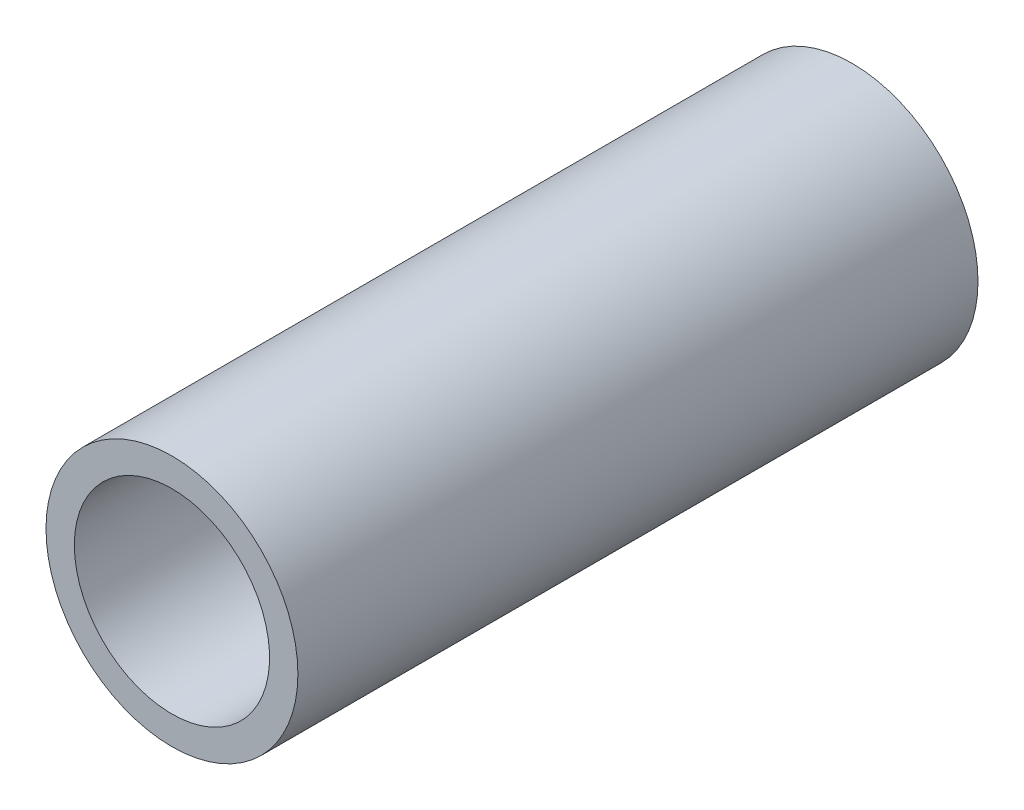
ISO-10303-21;
HEADER;
FILE_DESCRIPTION(('STEP AP214'),'2;1');
FILE_NAME('part.step','',(''),(''),'','','');
FILE_SCHEMA(('AUTOMOTIVE_DESIGN { 1 0 10303 214 1 1 1 1 }'));
ENDSEC;
DATA;
#1=APPLICATION_CONTEXT('core data for automotive mechanical design processes');
#2=APPLICATION_PROTOCOL_DEFINITION('international standard','automotive_design',2000,#1);
#3=PRODUCT_CONTEXT('',#1,'mechanical');
#4=PRODUCT('Part','Part','',(#3));
#5=PRODUCT_RELATED_PRODUCT_CATEGORY('part','',(#4));
#6=PRODUCT_DEFINITION_FORMATION('','',#4);
#7=PRODUCT_DEFINITION_CONTEXT('part definition',#1,'design');
#8=PRODUCT_DEFINITION('design','',#6,#7);
#9=PRODUCT_DEFINITION_SHAPE('','',#8);
#10=(LENGTH_UNIT() NAMED_UNIT(*) SI_UNIT(.MILLI.,.METRE.));
#11=(NAMED_UNIT(*) PLANE_ANGLE_UNIT() SI_UNIT($,.RADIAN.));
#12=(NAMED_UNIT(*) SI_UNIT($,.STERADIAN.) SOLID_ANGLE_UNIT());
#13=UNCERTAINTY_MEASURE_WITH_UNIT(LENGTH_MEASURE(1.E-05),#10,'distance_accuracy_value','');
#14=(GEOMETRIC_REPRESENTATION_CONTEXT(3) GLOBAL_UNCERTAINTY_ASSIGNED_CONTEXT((#13)) GLOBAL_UNIT_ASSIGNED_CONTEXT((#10,
#11,#12)) REPRESENTATION_CONTEXT('',''));
#15=CARTESIAN_POINT('',(0.,0.,0.));
#16=DIRECTION('',(0.,0.,1.));
#17=DIRECTION('',(1.,0.,0.));
#18=AXIS2_PLACEMENT_3D('',#15,#16,#17);
#19=CARTESIAN_POINT('',(0.,0.,5.4));
#20=DIRECTION('',(0.,0.,1.));
#21=DIRECTION('',(1.,0.,0.));
#22=AXIS2_PLACEMENT_3D('',#19,#20,#21);
#23=PLANE('',#22);
#24=CARTESIAN_POINT('',(0.,0.,5.4));
#25=DIRECTION('',(0.,0.,1.));
#26=DIRECTION('',(1.,0.,0.));
#27=AXIS2_PLACEMENT_3D('',#24,#25,#26);
#28=CIRCLE('',#27,1.);
#29=CARTESIAN_POINT('',(-1.,0.,5.4));
#30=VERTEX_POINT('',#29);
#31=EDGE_CURVE('E10',#30,#30,#28,.T.);
#32=ORIENTED_EDGE('',*,*,#31,.T.);
#33=EDGE_LOOP('',(#32));
#34=FACE_BOUND('',#33,.T.);
#35=CARTESIAN_POINT('',(0.,0.,5.4));
#36=DIRECTION('',(0.,0.,1.));
#37=DIRECTION('',(1.,0.,0.));
#38=AXIS2_PLACEMENT_3D('',#35,#36,#37);
#39=CIRCLE('',#38,0.775);
#40=CARTESIAN_POINT('',(-0.775,0.,5.4));
#41=VERTEX_POINT('',#40);
#42=EDGE_CURVE('E46',#41,#41,#39,.T.);
#43=ORIENTED_EDGE('',*,*,#42,.F.);
#44=EDGE_LOOP('',(#43));
#45=FACE_BOUND('',#44,.T.);
#46=ADVANCED_FACE('F35',(#34,#45),#23,.T.);
#47=CARTESIAN_POINT('',(0.,0.,0.));
#48=DIRECTION('',(0.,0.,1.));
#49=DIRECTION('',(1.,0.,0.));
#50=AXIS2_PLACEMENT_3D('',#47,#48,#49);
#51=PLANE('',#50);
#52=CARTESIAN_POINT('',(0.,0.,0.));
#53=DIRECTION('',(0.,0.,1.));
#54=DIRECTION('',(1.,0.,0.));
#55=AXIS2_PLACEMENT_3D('',#52,#53,#54);
#56=CIRCLE('',#55,1.);
#57=CARTESIAN_POINT('',(-1.,0.,0.));
#58=VERTEX_POINT('',#57);
#59=EDGE_CURVE('E39',#58,#58,#56,.T.);
#60=ORIENTED_EDGE('',*,*,#59,.F.);
#61=EDGE_LOOP('',(#60));
#62=FACE_BOUND('',#61,.T.);
#63=CARTESIAN_POINT('',(0.,0.,0.));
#64=DIRECTION('',(0.,0.,1.));
#65=DIRECTION('',(1.,0.,0.));
#66=AXIS2_PLACEMENT_3D('',#63,#64,#65);
#67=CIRCLE('',#66,0.775);
#68=CARTESIAN_POINT('',(-0.775,0.,0.));
#69=VERTEX_POINT('',#68);
#70=EDGE_CURVE('E48',#69,#69,#67,.T.);
#71=ORIENTED_EDGE('',*,*,#70,.T.);
#72=EDGE_LOOP('',(#71));
#73=FACE_BOUND('',#72,.T.);
#74=ADVANCED_FACE('F58',(#62,#73),#51,.F.);
#75=CARTESIAN_POINT('',(0.,0.,5.4));
#76=DIRECTION('',(0.,0.,-1.));
#77=DIRECTION('',(-1.,0.,0.));
#78=AXIS2_PLACEMENT_3D('',#75,#76,#77);
#79=CYLINDRICAL_SURFACE('',#78,1.);
#80=CARTESIAN_POINT('',(-1.,0.,5.4));
#81=CARTESIAN_POINT('',(-1.,0.,5.34375));
#82=CARTESIAN_POINT('',(-1.,0.,5.2875));
#83=CARTESIAN_POINT('',(-1.,0.,5.175));
#84=CARTESIAN_POINT('',(-1.,0.,5.11875));
#85=CARTESIAN_POINT('',(-1.,0.,5.00625));
#86=CARTESIAN_POINT('',(-1.,0.,4.95));
#87=CARTESIAN_POINT('',(-1.,0.,4.8375));
#88=CARTESIAN_POINT('',(-1.,0.,4.78125));
#89=CARTESIAN_POINT('',(-1.,0.,4.66875));
#90=CARTESIAN_POINT('',(-1.,0.,4.6125));
#91=CARTESIAN_POINT('',(-1.,0.,4.5));
#92=CARTESIAN_POINT('',(-1.,0.,4.44375));
#93=CARTESIAN_POINT('',(-1.,0.,4.33125));
#94=CARTESIAN_POINT('',(-1.,0.,4.275));
#95=CARTESIAN_POINT('',(-1.,0.,4.1625));
#96=CARTESIAN_POINT('',(-1.,0.,4.10625));
#97=CARTESIAN_POINT('',(-1.,0.,3.99375));
#98=CARTESIAN_POINT('',(-1.,0.,3.9375));
#99=CARTESIAN_POINT('',(-1.,0.,3.825));
#100=CARTESIAN_POINT('',(-1.,0.,3.76875));
#101=CARTESIAN_POINT('',(-1.,0.,3.65625));
#102=CARTESIAN_POINT('',(-1.,0.,3.6));
#103=CARTESIAN_POINT('',(-1.,0.,3.4875));
#104=CARTESIAN_POINT('',(-1.,0.,3.43125));
#105=CARTESIAN_POINT('',(-1.,0.,3.31875));
#106=CARTESIAN_POINT('',(-1.,0.,3.2625));
#107=CARTESIAN_POINT('',(-1.,0.,3.15));
#108=CARTESIAN_POINT('',(-1.,0.,3.09375));
#109=CARTESIAN_POINT('',(-1.,0.,2.98125));
#110=CARTESIAN_POINT('',(-1.,0.,2.925));
#111=CARTESIAN_POINT('',(-1.,0.,2.8125));
#112=CARTESIAN_POINT('',(-1.,0.,2.75625));
#113=CARTESIAN_POINT('',(-1.,0.,2.64375));
#114=CARTESIAN_POINT('',(-1.,0.,2.5875));
#115=CARTESIAN_POINT('',(-1.,0.,2.475));
#116=CARTESIAN_POINT('',(-1.,0.,2.41875));
#117=CARTESIAN_POINT('',(-1.,0.,2.30625));
#118=CARTESIAN_POINT('',(-1.,0.,2.25));
#119=CARTESIAN_POINT('',(-1.,0.,2.1375));
#120=CARTESIAN_POINT('',(-1.,0.,2.08125));
#121=CARTESIAN_POINT('',(-1.,0.,1.96875));
#122=CARTESIAN_POINT('',(-1.,0.,1.9125));
#123=CARTESIAN_POINT('',(-1.,0.,1.8));
#124=CARTESIAN_POINT('',(-1.,0.,1.74375));
#125=CARTESIAN_POINT('',(-1.,0.,1.63125));
#126=CARTESIAN_POINT('',(-1.,0.,1.575));
#127=CARTESIAN_POINT('',(-1.,0.,1.4625));
#128=CARTESIAN_POINT('',(-1.,0.,1.40625));
#129=CARTESIAN_POINT('',(-1.,0.,1.29375));
#130=CARTESIAN_POINT('',(-1.,0.,1.2375));
#131=CARTESIAN_POINT('',(-1.,0.,1.125));
#132=CARTESIAN_POINT('',(-1.,0.,1.06875));
#133=CARTESIAN_POINT('',(-1.,0.,0.956249999999999));
#134=CARTESIAN_POINT('',(-1.,0.,0.899999999999999));
#135=CARTESIAN_POINT('',(-1.,0.,0.787499999999999));
#136=CARTESIAN_POINT('',(-1.,0.,0.731249999999999));
#137=CARTESIAN_POINT('',(-1.,0.,0.618749999999999));
#138=CARTESIAN_POINT('',(-1.,0.,0.562499999999999));
#139=CARTESIAN_POINT('',(-1.,0.,0.449999999999999));
#140=CARTESIAN_POINT('',(-1.,0.,0.393749999999999));
#141=CARTESIAN_POINT('',(-1.,0.,0.281249999999999));
#142=CARTESIAN_POINT('',(-1.,0.,0.224999999999999));
#143=CARTESIAN_POINT('',(-1.,0.,0.112499999999999));
#144=CARTESIAN_POINT('',(-1.,0.,0.0562499999999989));
#145=CARTESIAN_POINT('',(-1.,0.,0.));
#146=B_SPLINE_CURVE_WITH_KNOTS('',3,(#80,#81,#82,#83,#84,#85,#86,#87,#88,#89,#90,#91,#92,#93,
#94,#95,#96,#97,#98,#99,#100,#101,#102,#103,#104,#105,#106,#107,#108,#109,#110,#111,#112,#113,
#114,#115,#116,#117,#118,#119,#120,#121,#122,#123,#124,#125,#126,#127,#128,#129,#130,#131,#132,
#133,#134,#135,#136,#137,#138,#139,#140,#141,#142,#143,#144,#145),.UNSPECIFIED.,.F.,.F.,(4,2,2,
2,2,2,2,2,2,2,2,2,2,2,2,2,2,2,2,2,2,2,2,2,2,2,2,2,2,2,2,2,4),(0.,0.16875,0.337499999999999,
0.50625,0.674999999999999,0.84375,1.0125,1.18125,1.35,1.51875,1.6875,1.85625,2.025,2.19375,
2.3625,2.53125,2.7,2.86875,3.0375,3.20625,3.375,3.54375,3.7125,3.88125,4.05,4.21875,4.3875,
4.55625,4.725,4.89375,5.0625,5.23125,5.4),.UNSPECIFIED.);
#147=EDGE_CURVE('BSEAM37',#30,#58,#146,.T.);
#148=ORIENTED_EDGE('',*,*,#31,.F.);
#149=ORIENTED_EDGE('',*,*,#59,.T.);
#150=ORIENTED_EDGE('',*,*,#147,.T.);
#151=ORIENTED_EDGE('',*,*,#147,.F.);
#152=EDGE_LOOP('',(#148,#150,#149,#151));
#153=FACE_BOUND('',#152,.T.);
#154=ADVANCED_FACE('F37',(#153),#79,.T.);
#155=CARTESIAN_POINT('',(0.,0.,5.4));
#156=DIRECTION('',(0.,0.,-1.));
#157=DIRECTION('',(-1.,0.,0.));
#158=AXIS2_PLACEMENT_3D('',#155,#156,#157);
#159=CYLINDRICAL_SURFACE('',#158,0.775);
#160=CARTESIAN_POINT('',(-0.775,0.,5.4));
#161=CARTESIAN_POINT('',(-0.775,0.,5.34375));
#162=CARTESIAN_POINT('',(-0.775,0.,5.2875));
#163=CARTESIAN_POINT('',(-0.775,0.,5.175));
#164=CARTESIAN_POINT('',(-0.775,0.,5.11875));
#165=CARTESIAN_POINT('',(-0.775,0.,5.00625));
#166=CARTESIAN_POINT('',(-0.775,0.,4.95));
#167=CARTESIAN_POINT('',(-0.775,0.,4.8375));
#168=CARTESIAN_POINT('',(-0.775,0.,4.78125));
#169=CARTESIAN_POINT('',(-0.775,0.,4.66875));
#170=CARTESIAN_POINT('',(-0.775,0.,4.6125));
#171=CARTESIAN_POINT('',(-0.775,0.,4.5));
#172=CARTESIAN_POINT('',(-0.775,0.,4.44375));
#173=CARTESIAN_POINT('',(-0.775,0.,4.33125));
#174=CARTESIAN_POINT('',(-0.775,0.,4.275));
#175=CARTESIAN_POINT('',(-0.775,0.,4.1625));
#176=CARTESIAN_POINT('',(-0.775,0.,4.10625));
#177=CARTESIAN_POINT('',(-0.775,0.,3.99375));
#178=CARTESIAN_POINT('',(-0.775,0.,3.9375));
#179=CARTESIAN_POINT('',(-0.775,0.,3.825));
#180=CARTESIAN_POINT('',(-0.775,0.,3.76875));
#181=CARTESIAN_POINT('',(-0.775,0.,3.65625));
#182=CARTESIAN_POINT('',(-0.775,0.,3.6));
#183=CARTESIAN_POINT('',(-0.775,0.,3.4875));
#184=CARTESIAN_POINT('',(-0.775,0.,3.43125));
#185=CARTESIAN_POINT('',(-0.775,0.,3.31875));
#186=CARTESIAN_POINT('',(-0.775,0.,3.2625));
#187=CARTESIAN_POINT('',(-0.775,0.,3.15));
#188=CARTESIAN_POINT('',(-0.775,0.,3.09375));
#189=CARTESIAN_POINT('',(-0.775,0.,2.98125));
#190=CARTESIAN_POINT('',(-0.775,0.,2.925));
#191=CARTESIAN_POINT('',(-0.775,0.,2.8125));
#192=CARTESIAN_POINT('',(-0.775,0.,2.75625));
#193=CARTESIAN_POINT('',(-0.775,0.,2.64375));
#194=CARTESIAN_POINT('',(-0.775,0.,2.5875));
#195=CARTESIAN_POINT('',(-0.775,0.,2.475));
#196=CARTESIAN_POINT('',(-0.775,0.,2.41875));
#197=CARTESIAN_POINT('',(-0.775,0.,2.30625));
#198=CARTESIAN_POINT('',(-0.775,0.,2.25));
#199=CARTESIAN_POINT('',(-0.775,0.,2.1375));
#200=CARTESIAN_POINT('',(-0.775,0.,2.08125));
#201=CARTESIAN_POINT('',(-0.775,0.,1.96875));
#202=CARTESIAN_POINT('',(-0.775,0.,1.9125));
#203=CARTESIAN_POINT('',(-0.775,0.,1.8));
#204=CARTESIAN_POINT('',(-0.775,0.,1.74375));
#205=CARTESIAN_POINT('',(-0.775,0.,1.63125));
#206=CARTESIAN_POINT('',(-0.775,0.,1.575));
#207=CARTESIAN_POINT('',(-0.775,0.,1.4625));
#208=CARTESIAN_POINT('',(-0.775,0.,1.40625));
#209=CARTESIAN_POINT('',(-0.775,0.,1.29375));
#210=CARTESIAN_POINT('',(-0.775,0.,1.2375));
#211=CARTESIAN_POINT('',(-0.775,0.,1.125));
#212=CARTESIAN_POINT('',(-0.775,0.,1.06875));
#213=CARTESIAN_POINT('',(-0.775,0.,0.95625));
#214=CARTESIAN_POINT('',(-0.775,0.,0.9));
#215=CARTESIAN_POINT('',(-0.775,0.,0.7875));
#216=CARTESIAN_POINT('',(-0.775,0.,0.73125));
#217=CARTESIAN_POINT('',(-0.775,0.,0.618749999999999));
#218=CARTESIAN_POINT('',(-0.775,0.,0.562499999999999));
#219=CARTESIAN_POINT('',(-0.775,0.,0.449999999999999));
#220=CARTESIAN_POINT('',(-0.775,0.,0.393749999999999));
#221=CARTESIAN_POINT('',(-0.775,0.,0.281249999999999));
#222=CARTESIAN_POINT('',(-0.775,0.,0.225));
#223=CARTESIAN_POINT('',(-0.775,0.,0.112499999999999));
#224=CARTESIAN_POINT('',(-0.775,0.,0.0562499999999992));
#225=CARTESIAN_POINT('',(-0.775,0.,0.));
#226=B_SPLINE_CURVE_WITH_KNOTS('',3,(#160,#161,#162,#163,#164,#165,#166,#167,#168,#169,#170,
#171,#172,#173,#174,#175,#176,#177,#178,#179,#180,#181,#182,#183,#184,#185,#186,#187,#188,#189,
#190,#191,#192,#193,#194,#195,#196,#197,#198,#199,#200,#201,#202,#203,#204,#205,#206,#207,#208,
#209,#210,#211,#212,#213,#214,#215,#216,#217,#218,#219,#220,#221,#222,#223,#224,#225),
.UNSPECIFIED.,.F.,.F.,(4,2,2,2,2,2,2,2,2,2,2,2,2,2,2,2,2,2,2,2,2,2,2,2,2,2,2,2,2,2,2,2,4),(0.,
0.168750000000001,0.3375,0.506250000000001,0.675,0.843750000000001,1.0125,1.18125,1.35,1.51875,
1.6875,1.85625,2.025,2.19375,2.3625,2.53125,2.7,2.86875,3.0375,3.20625,3.375,3.54375,3.7125,
3.88125,4.05,4.21875,4.3875,4.55625,4.725,4.89375,5.0625,5.23125,5.4),.UNSPECIFIED.);
#227=EDGE_CURVE('BSEAM54',#41,#69,#226,.T.);
#228=ORIENTED_EDGE('',*,*,#42,.T.);
#229=ORIENTED_EDGE('',*,*,#70,.F.);
#230=ORIENTED_EDGE('',*,*,#227,.T.);
#231=ORIENTED_EDGE('',*,*,#227,.F.);
#232=EDGE_LOOP('',(#228,#230,#229,#231));
#233=FACE_BOUND('',#232,.T.);
#234=ADVANCED_FACE('F54',(#233),#159,.F.);
#235=CLOSED_SHELL('',(#46,#74,#154,#234));
#236=MANIFOLD_SOLID_BREP('B2',#235);
#237=ADVANCED_BREP_SHAPE_REPRESENTATION('',(#18,#236),#14);
#238=SHAPE_DEFINITION_REPRESENTATION(#9,#237);
ENDSEC;
END-ISO-10303-21;
